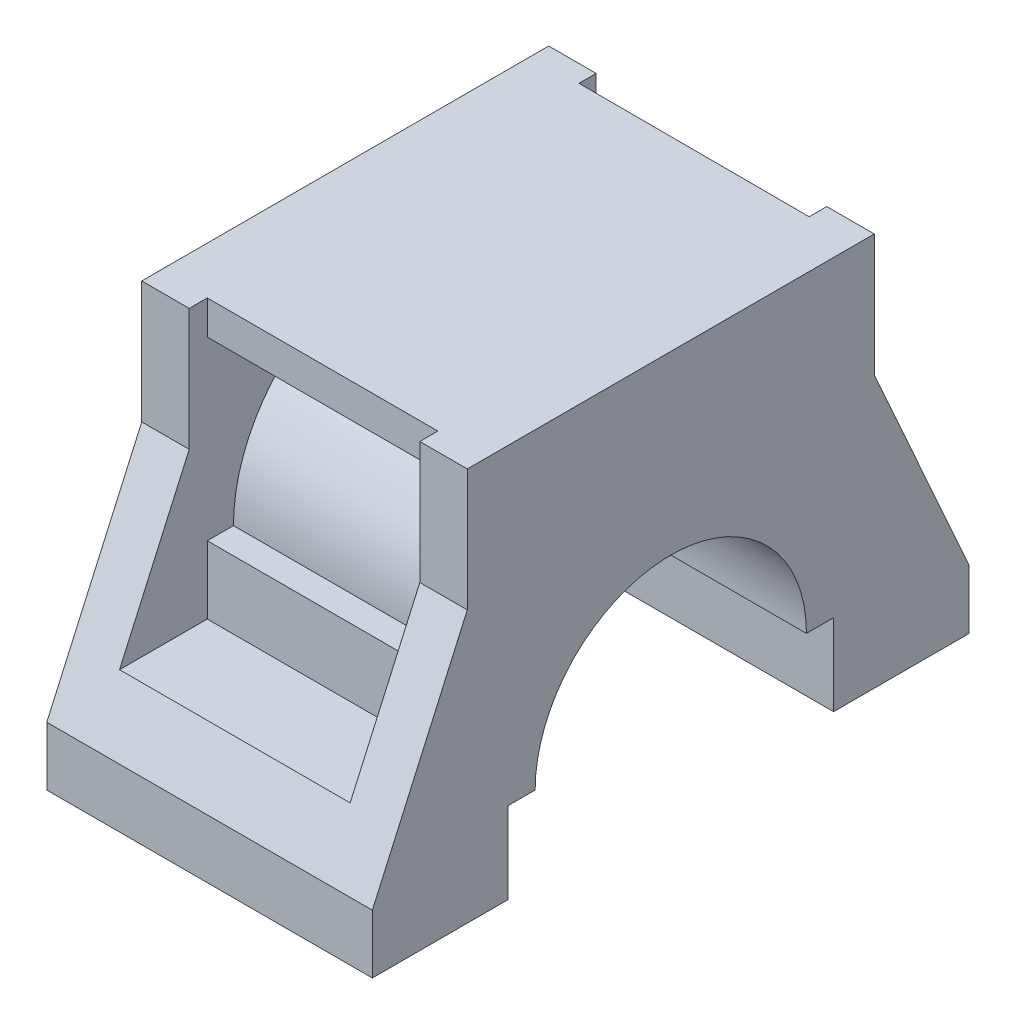
ISO-10303-21;
HEADER;
FILE_DESCRIPTION(('STEP AP214'),'2;1');
FILE_NAME('part.step','',(''),(''),'','','');
FILE_SCHEMA(('AUTOMOTIVE_DESIGN { 1 0 10303 214 1 1 1 1 }'));
ENDSEC;
DATA;
#1=APPLICATION_CONTEXT('core data for automotive mechanical design processes');
#2=APPLICATION_PROTOCOL_DEFINITION('international standard','automotive_design',2000,#1);
#3=PRODUCT_CONTEXT('',#1,'mechanical');
#4=PRODUCT('Part','Part','',(#3));
#5=PRODUCT_RELATED_PRODUCT_CATEGORY('part','',(#4));
#6=PRODUCT_DEFINITION_FORMATION('','',#4);
#7=PRODUCT_DEFINITION_CONTEXT('part definition',#1,'design');
#8=PRODUCT_DEFINITION('design','',#6,#7);
#9=PRODUCT_DEFINITION_SHAPE('','',#8);
#10=(LENGTH_UNIT() NAMED_UNIT(*) SI_UNIT(.MILLI.,.METRE.));
#11=(NAMED_UNIT(*) PLANE_ANGLE_UNIT() SI_UNIT($,.RADIAN.));
#12=(NAMED_UNIT(*) SI_UNIT($,.STERADIAN.) SOLID_ANGLE_UNIT());
#13=UNCERTAINTY_MEASURE_WITH_UNIT(LENGTH_MEASURE(1.E-05),#10,'distance_accuracy_value','');
#14=(GEOMETRIC_REPRESENTATION_CONTEXT(3) GLOBAL_UNCERTAINTY_ASSIGNED_CONTEXT((#13)) GLOBAL_UNIT_ASSIGNED_CONTEXT((#10,
#11,#12)) REPRESENTATION_CONTEXT('',''));
#15=CARTESIAN_POINT('',(0.,0.,0.));
#16=DIRECTION('',(0.,0.,1.));
#17=DIRECTION('',(1.,0.,0.));
#18=AXIS2_PLACEMENT_3D('',#15,#16,#17);
#19=CARTESIAN_POINT('',(-41.,0.,0.));
#20=DIRECTION('',(1.,0.,0.));
#21=DIRECTION('',(0.,0.,-1.));
#22=AXIS2_PLACEMENT_3D('',#19,#20,#21);
#23=PLANE('',#22);
#24=DIRECTION('',(0.,1.,0.));
#25=VECTOR('',#24,1.);
#26=CARTESIAN_POINT('',(-41.,53.,-48.7073269092221));
#27=LINE('',#26,#25);
#28=CARTESIAN_POINT('',(-41.,53.,-48.7073269092221));
#29=VERTEX_POINT('',#28);
#30=CARTESIAN_POINT('',(-41.,58.,-48.7073269092222));
#31=VERTEX_POINT('',#30);
#32=EDGE_CURVE('E57',#29,#31,#27,.T.);
#33=ORIENTED_EDGE('',*,*,#32,.F.);
#34=DIRECTION('',(0.,0.,1.));
#35=VECTOR('',#34,1.);
#36=CARTESIAN_POINT('',(-41.,53.,6.10030878605199));
#37=LINE('',#36,#35);
#38=CARTESIAN_POINT('',(-41.,53.,6.10030878605199));
#39=VERTEX_POINT('',#38);
#40=EDGE_CURVE('E52',#29,#39,#37,.T.);
#41=ORIENTED_EDGE('',*,*,#40,.T.);
#42=DIRECTION('',(0.,1.,0.));
#43=VECTOR('',#42,1.);
#44=CARTESIAN_POINT('',(-41.,53.,6.10030878605199));
#45=LINE('',#44,#43);
#46=CARTESIAN_POINT('',(-41.,58.,6.10030878605199));
#47=VERTEX_POINT('',#46);
#48=EDGE_CURVE('E268',#39,#47,#45,.T.);
#49=ORIENTED_EDGE('',*,*,#48,.T.);
#50=DIRECTION('',(0.,0.,1.));
#51=VECTOR('',#50,1.);
#52=CARTESIAN_POINT('',(-41.,58.,1.03810320160909));
#53=LINE('',#52,#51);
#54=CARTESIAN_POINT('',(-41.,58.,8.76398802670966));
#55=VERTEX_POINT('',#54);
#56=EDGE_CURVE('E361',#47,#55,#53,.T.);
#57=ORIENTED_EDGE('',*,*,#56,.T.);
#58=DIRECTION('',(0.,-1.,0.));
#59=VECTOR('',#58,1.);
#60=CARTESIAN_POINT('',(-41.,58.,8.76398802670966));
#61=LINE('',#60,#59);
#62=CARTESIAN_POINT('',(-41.,40.,8.76398802670966));
#63=VERTEX_POINT('',#62);
#64=EDGE_CURVE('E352',#55,#63,#61,.T.);
#65=ORIENTED_EDGE('',*,*,#64,.T.);
#66=DIRECTION('',(0.,-0.913045383372762,0.407857975160086));
#67=VECTOR('',#66,1.);
#68=CARTESIAN_POINT('',(-41.,40.,8.76398802670966));
#69=LINE('',#68,#67);
#70=CARTESIAN_POINT('',(-41.,17.,19.0381032016091));
#71=VERTEX_POINT('',#70);
#72=EDGE_CURVE('E354',#63,#71,#69,.T.);
#73=ORIENTED_EDGE('',*,*,#72,.T.);
#74=DIRECTION('',(0.,0.,-1.));
#75=VECTOR('',#74,1.);
#76=CARTESIAN_POINT('',(-41.,17.,19.0381032016091));
#77=LINE('',#76,#75);
#78=CARTESIAN_POINT('',(-41.,17.,6.10030878605199));
#79=VERTEX_POINT('',#78);
#80=EDGE_CURVE('E358',#71,#79,#77,.T.);
#81=ORIENTED_EDGE('',*,*,#80,.T.);
#82=DIRECTION('',(0.,-1.,0.));
#83=VECTOR('',#82,1.);
#84=CARTESIAN_POINT('',(-41.,27.,6.10030878605199));
#85=LINE('',#84,#83);
#86=CARTESIAN_POINT('',(-41.,27.,6.10030878605199));
#87=VERTEX_POINT('',#86);
#88=EDGE_CURVE('E348',#87,#79,#85,.T.);
#89=ORIENTED_EDGE('',*,*,#88,.F.);
#90=DIRECTION('',(0.,0.,1.));
#91=VECTOR('',#90,1.);
#92=CARTESIAN_POINT('',(-41.,27.,6.10030878605199));
#93=LINE('',#92,#91);
#94=CARTESIAN_POINT('',(-41.,27.,2.24605546048965));
#95=VERTEX_POINT('',#94);
#96=EDGE_CURVE('E336',#95,#87,#93,.T.);
#97=ORIENTED_EDGE('',*,*,#96,.F.);
#98=CARTESIAN_POINT('',(-41.,27.,-21.7539445395103));
#99=DIRECTION('',(1.,0.,0.));
#100=DIRECTION('',(0.,0.,1.));
#101=AXIS2_PLACEMENT_3D('',#98,#99,#100);
#102=CIRCLE('',#101,24.);
#103=CARTESIAN_POINT('',(-41.,36.9865070630861,-43.5775481988268));
#104=VERTEX_POINT('',#103);
#105=EDGE_CURVE('E305',#104,#95,#102,.T.);
#106=ORIENTED_EDGE('',*,*,#105,.F.);
#107=DIRECTION('',(0.,-1.,0.));
#108=VECTOR('',#107,1.);
#109=CARTESIAN_POINT('',(-41.,37.,-43.5775481988268));
#110=LINE('',#109,#108);
#111=CARTESIAN_POINT('',(-41.,37.,-43.5775481988268));
#112=VERTEX_POINT('',#111);
#113=EDGE_CURVE('E302',#112,#104,#110,.T.);
#114=ORIENTED_EDGE('',*,*,#113,.F.);
#115=DIRECTION('',(0.,0.,1.));
#116=VECTOR('',#115,1.);
#117=CARTESIAN_POINT('',(-41.,37.,-48.6375481988268));
#118=LINE('',#117,#116);
#119=CARTESIAN_POINT('',(-41.,37.,-48.6375481988268));
#120=VERTEX_POINT('',#119);
#121=EDGE_CURVE('E279',#120,#112,#118,.T.);
#122=ORIENTED_EDGE('',*,*,#121,.F.);
#123=DIRECTION('',(0.,-1.,0.));
#124=VECTOR('',#123,1.);
#125=CARTESIAN_POINT('',(-41.,37.,-48.6375481988268));
#126=LINE('',#125,#124);
#127=CARTESIAN_POINT('',(-41.,27.,-48.6375481988268));
#128=VERTEX_POINT('',#127);
#129=EDGE_CURVE('E292',#120,#128,#126,.T.);
#130=ORIENTED_EDGE('',*,*,#129,.T.);
#131=DIRECTION('',(0.,0.,1.));
#132=VECTOR('',#131,1.);
#133=CARTESIAN_POINT('',(-41.,27.,-65.2360119732903));
#134=LINE('',#133,#132);
#135=CARTESIAN_POINT('',(-41.,27.,-57.0431205504074));
#136=VERTEX_POINT('',#135);
#137=EDGE_CURVE('E319',#136,#128,#134,.T.);
#138=ORIENTED_EDGE('',*,*,#137,.F.);
#139=DIRECTION('',(0.,0.913045383372762,0.407857975160086));
#140=VECTOR('',#139,1.);
#141=CARTESIAN_POINT('',(-41.,40.,-51.2360119732903));
#142=LINE('',#141,#140);
#143=CARTESIAN_POINT('',(-41.,40.,-51.2360119732903));
#144=VERTEX_POINT('',#143);
#145=EDGE_CURVE('E328',#136,#144,#142,.T.);
#146=ORIENTED_EDGE('',*,*,#145,.T.);
#147=DIRECTION('',(0.,1.,0.));
#148=VECTOR('',#147,1.);
#149=CARTESIAN_POINT('',(-41.,58.,-51.2360119732903));
#150=LINE('',#149,#148);
#151=CARTESIAN_POINT('',(-41.,58.,-51.2360119732903));
#152=VERTEX_POINT('',#151);
#153=EDGE_CURVE('E330',#144,#152,#150,.T.);
#154=ORIENTED_EDGE('',*,*,#153,.T.);
#155=EDGE_CURVE('E362',#152,#31,#53,.T.);
#156=ORIENTED_EDGE('',*,*,#155,.T.);
#157=EDGE_LOOP('',(#33,#41,#49,#57,#65,#73,#81,#89,#97,#106,#114,#122,#130,#138,#146,#154,#156));
#158=FACE_BOUND('',#157,.T.);
#159=ADVANCED_FACE('F37',(#158),#23,.T.);
#160=CARTESIAN_POINT('',(-7.,0.,0.));
#161=DIRECTION('',(1.,0.,0.));
#162=DIRECTION('',(0.,0.,-1.));
#163=AXIS2_PLACEMENT_3D('',#160,#161,#162);
#164=PLANE('',#163);
#165=DIRECTION('',(0.,0.,-1.));
#166=VECTOR('',#165,1.);
#167=CARTESIAN_POINT('',(-7.,53.,-48.6375481988268));
#168=LINE('',#167,#166);
#169=CARTESIAN_POINT('',(-7.,53.,6.10030878605199));
#170=VERTEX_POINT('',#169);
#171=CARTESIAN_POINT('',(-7.,53.,-48.6375481988268));
#172=VERTEX_POINT('',#171);
#173=EDGE_CURVE('E252',#170,#172,#168,.T.);
#174=ORIENTED_EDGE('',*,*,#173,.T.);
#175=DIRECTION('',(0.,1.,0.));
#176=VECTOR('',#175,1.);
#177=CARTESIAN_POINT('',(-7.,53.,-48.6375481988268));
#178=LINE('',#177,#176);
#179=CARTESIAN_POINT('',(-7.,58.,-48.6375481988268));
#180=VERTEX_POINT('',#179);
#181=EDGE_CURVE('E273',#172,#180,#178,.T.);
#182=ORIENTED_EDGE('',*,*,#181,.T.);
#183=DIRECTION('',(0.,0.,1.));
#184=VECTOR('',#183,1.);
#185=CARTESIAN_POINT('',(-7.,58.,1.03810320160909));
#186=LINE('',#185,#184);
#187=CARTESIAN_POINT('',(-7.,58.,-51.2360119732903));
#188=VERTEX_POINT('',#187);
#189=EDGE_CURVE('E355',#188,#180,#186,.T.);
#190=ORIENTED_EDGE('',*,*,#189,.F.);
#191=DIRECTION('',(0.,-1.,0.));
#192=VECTOR('',#191,1.);
#193=CARTESIAN_POINT('',(-7.,58.,-51.2360119732903));
#194=LINE('',#193,#192);
#195=CARTESIAN_POINT('',(-7.,40.,-51.2360119732903));
#196=VERTEX_POINT('',#195);
#197=EDGE_CURVE('E326',#188,#196,#194,.T.);
#198=ORIENTED_EDGE('',*,*,#197,.T.);
#199=DIRECTION('',(0.,-0.913045383372762,-0.407857975160086));
#200=VECTOR('',#199,1.);
#201=CARTESIAN_POINT('',(-7.,40.,-51.2360119732903));
#202=LINE('',#201,#200);
#203=CARTESIAN_POINT('',(-7.,27.,-57.0431205504074));
#204=VERTEX_POINT('',#203);
#205=EDGE_CURVE('E322',#196,#204,#202,.T.);
#206=ORIENTED_EDGE('',*,*,#205,.T.);
#207=DIRECTION('',(0.,0.,1.));
#208=VECTOR('',#207,1.);
#209=CARTESIAN_POINT('',(-7.,27.,-65.2360119732903));
#210=LINE('',#209,#208);
#211=CARTESIAN_POINT('',(-7.,27.,-48.6375481988268));
#212=VERTEX_POINT('',#211);
#213=EDGE_CURVE('E318',#204,#212,#210,.T.);
#214=ORIENTED_EDGE('',*,*,#213,.T.);
#215=DIRECTION('',(0.,-1.,0.));
#216=VECTOR('',#215,1.);
#217=CARTESIAN_POINT('',(-7.,37.,-48.6375481988268));
#218=LINE('',#217,#216);
#219=CARTESIAN_POINT('',(-7.,37.,-48.6375481988268));
#220=VERTEX_POINT('',#219);
#221=EDGE_CURVE('E296',#220,#212,#218,.T.);
#222=ORIENTED_EDGE('',*,*,#221,.F.);
#223=DIRECTION('',(0.,0.,-1.));
#224=VECTOR('',#223,1.);
#225=CARTESIAN_POINT('',(-7.,37.,-43.5775481988268));
#226=LINE('',#225,#224);
#227=CARTESIAN_POINT('',(-7.,37.,-43.5775481988268));
#228=VERTEX_POINT('',#227);
#229=EDGE_CURVE('E286',#228,#220,#226,.T.);
#230=ORIENTED_EDGE('',*,*,#229,.F.);
#231=DIRECTION('',(0.,-1.,0.));
#232=VECTOR('',#231,1.);
#233=CARTESIAN_POINT('',(-7.,37.,-43.5775481988268));
#234=LINE('',#233,#232);
#235=CARTESIAN_POINT('',(-7.,36.9865070630861,-43.5775481988268));
#236=VERTEX_POINT('',#235);
#237=EDGE_CURVE('E299',#228,#236,#234,.T.);
#238=ORIENTED_EDGE('',*,*,#237,.T.);
#239=CARTESIAN_POINT('',(-7.,27.,-21.7539445395103));
#240=DIRECTION('',(1.,0.,0.));
#241=DIRECTION('',(0.,0.,1.));
#242=AXIS2_PLACEMENT_3D('',#239,#240,#241);
#243=CIRCLE('',#242,24.);
#244=CARTESIAN_POINT('',(-7.,27.,2.24605546048965));
#245=VERTEX_POINT('',#244);
#246=EDGE_CURVE('E306',#236,#245,#243,.T.);
#247=ORIENTED_EDGE('',*,*,#246,.T.);
#248=DIRECTION('',(0.,0.,-1.));
#249=VECTOR('',#248,1.);
#250=CARTESIAN_POINT('',(-7.,27.,1.03810320160909));
#251=LINE('',#250,#249);
#252=CARTESIAN_POINT('',(-7.,27.,6.10030878605199));
#253=VERTEX_POINT('',#252);
#254=EDGE_CURVE('E341',#253,#245,#251,.T.);
#255=ORIENTED_EDGE('',*,*,#254,.F.);
#256=DIRECTION('',(0.,-1.,0.));
#257=VECTOR('',#256,1.);
#258=CARTESIAN_POINT('',(-7.,27.,6.10030878605199));
#259=LINE('',#258,#257);
#260=CARTESIAN_POINT('',(-7.,17.,6.10030878605199));
#261=VERTEX_POINT('',#260);
#262=EDGE_CURVE('E344',#253,#261,#259,.T.);
#263=ORIENTED_EDGE('',*,*,#262,.T.);
#264=DIRECTION('',(0.,0.,-1.));
#265=VECTOR('',#264,1.);
#266=CARTESIAN_POINT('',(-7.,17.,19.0381032016091));
#267=LINE('',#266,#265);
#268=CARTESIAN_POINT('',(-7.,17.,19.0381032016091));
#269=VERTEX_POINT('',#268);
#270=EDGE_CURVE('E370',#269,#261,#267,.T.);
#271=ORIENTED_EDGE('',*,*,#270,.F.);
#272=DIRECTION('',(0.,-0.913045383372762,0.407857975160086));
#273=VECTOR('',#272,1.);
#274=CARTESIAN_POINT('',(-7.,40.,8.76398802670966));
#275=LINE('',#274,#273);
#276=CARTESIAN_POINT('',(-7.,40.,8.76398802670966));
#277=VERTEX_POINT('',#276);
#278=EDGE_CURVE('E367',#277,#269,#275,.T.);
#279=ORIENTED_EDGE('',*,*,#278,.F.);
#280=DIRECTION('',(0.,-1.,0.));
#281=VECTOR('',#280,1.);
#282=CARTESIAN_POINT('',(-7.,58.,8.76398802670966));
#283=LINE('',#282,#281);
#284=CARTESIAN_POINT('',(-7.,58.,8.76398802670966));
#285=VERTEX_POINT('',#284);
#286=EDGE_CURVE('E351',#285,#277,#283,.T.);
#287=ORIENTED_EDGE('',*,*,#286,.F.);
#288=CARTESIAN_POINT('',(-7.,58.,6.10030878605199));
#289=VERTEX_POINT('',#288);
#290=EDGE_CURVE('E272',#289,#285,#186,.T.);
#291=ORIENTED_EDGE('',*,*,#290,.F.);
#292=DIRECTION('',(0.,1.,0.));
#293=VECTOR('',#292,1.);
#294=CARTESIAN_POINT('',(-7.,53.,6.10030878605199));
#295=LINE('',#294,#293);
#296=EDGE_CURVE('E266',#170,#289,#295,.T.);
#297=ORIENTED_EDGE('',*,*,#296,.F.);
#298=EDGE_LOOP('',(#174,#182,#190,#198,#206,#214,#222,#230,#238,#247,#255,#263,#271,#279,#287,
#291,#297));
#299=FACE_BOUND('',#298,.T.);
#300=ADVANCED_FACE('F270',(#299),#164,.F.);
#301=CARTESIAN_POINT('',(-7.,27.,-65.2360119732903));
#302=DIRECTION('',(0.,-1.,0.));
#303=DIRECTION('',(0.,0.,-1.));
#304=AXIS2_PLACEMENT_3D('',#301,#302,#303);
#305=PLANE('',#304);
#306=DIRECTION('',(-1.,0.,0.));
#307=VECTOR('',#306,1.);
#308=CARTESIAN_POINT('',(-7.,27.,-48.6375481988268));
#309=LINE('',#308,#307);
#310=EDGE_CURVE('E283',#212,#128,#309,.T.);
#311=ORIENTED_EDGE('',*,*,#310,.F.);
#312=ORIENTED_EDGE('',*,*,#213,.F.);
#313=DIRECTION('',(-1.,0.,0.));
#314=VECTOR('',#313,1.);
#315=CARTESIAN_POINT('',(-48.,27.,-57.0431205504074));
#316=LINE('',#315,#314);
#317=EDGE_CURVE('E333',#204,#136,#316,.T.);
#318=ORIENTED_EDGE('',*,*,#317,.T.);
#319=ORIENTED_EDGE('',*,*,#137,.T.);
#320=EDGE_LOOP('',(#311,#312,#318,#319));
#321=FACE_BOUND('',#320,.T.);
#322=ADVANCED_FACE('F532',(#321),#305,.F.);
#323=CARTESIAN_POINT('',(-7.,27.,-21.7539445395103));
#324=DIRECTION('',(-1.,0.,0.));
#325=DIRECTION('',(0.,0.,1.));
#326=AXIS2_PLACEMENT_3D('',#323,#324,#325);
#327=CYLINDRICAL_SURFACE('',#326,24.);
#328=DIRECTION('',(-1.,0.,0.));
#329=VECTOR('',#328,1.);
#330=CARTESIAN_POINT('',(-7.,36.9865070630861,-43.5775481988268));
#331=LINE('',#330,#329);
#332=EDGE_CURVE('E11',#104,#236,#331,.F.);
#333=ORIENTED_EDGE('',*,*,#332,.F.);
#334=ORIENTED_EDGE('',*,*,#105,.T.);
#335=DIRECTION('',(-1.,0.,0.));
#336=VECTOR('',#335,1.);
#337=CARTESIAN_POINT('',(-7.,27.,2.24605546048965));
#338=LINE('',#337,#336);
#339=EDGE_CURVE('E312',#245,#95,#338,.T.);
#340=ORIENTED_EDGE('',*,*,#339,.F.);
#341=ORIENTED_EDGE('',*,*,#246,.F.);
#342=EDGE_LOOP('',(#333,#334,#340,#341));
#343=FACE_BOUND('',#342,.T.);
#344=ADVANCED_FACE('F675',(#343),#327,.T.);
#345=CARTESIAN_POINT('',(0.,27.,0.));
#346=DIRECTION('',(0.,-1.,0.));
#347=DIRECTION('',(0.,0.,-1.));
#348=AXIS2_PLACEMENT_3D('',#345,#346,#347);
#349=PLANE('',#348);
#350=ORIENTED_EDGE('',*,*,#339,.T.);
#351=ORIENTED_EDGE('',*,*,#96,.T.);
#352=DIRECTION('',(1.,0.,0.));
#353=VECTOR('',#352,1.);
#354=CARTESIAN_POINT('',(-7.,27.,6.10030878605199));
#355=LINE('',#354,#353);
#356=EDGE_CURVE('E338',#87,#253,#355,.T.);
#357=ORIENTED_EDGE('',*,*,#356,.T.);
#358=ORIENTED_EDGE('',*,*,#254,.T.);
#359=EDGE_LOOP('',(#350,#351,#357,#358));
#360=FACE_BOUND('',#359,.T.);
#361=ADVANCED_FACE('F674',(#360),#349,.F.);
#362=CARTESIAN_POINT('',(-48.,58.,-51.2360119732903));
#363=DIRECTION('',(0.,0.,-1.));
#364=DIRECTION('',(-1.,0.,0.));
#365=AXIS2_PLACEMENT_3D('',#362,#363,#364);
#366=PLANE('',#365);
#367=ORIENTED_EDGE('',*,*,#153,.F.);
#368=DIRECTION('',(1.,0.,0.));
#369=VECTOR('',#368,1.);
#370=CARTESIAN_POINT('',(-48.,40.,-51.2360119732903));
#371=LINE('',#370,#369);
#372=CARTESIAN_POINT('',(-48.,40.,-51.2360119732903));
#373=VERTEX_POINT('',#372);
#374=EDGE_CURVE('E478',#373,#144,#371,.T.);
#375=ORIENTED_EDGE('',*,*,#374,.F.);
#376=DIRECTION('',(0.,1.,0.));
#377=VECTOR('',#376,1.);
#378=CARTESIAN_POINT('',(-48.,58.,-51.2360119732903));
#379=LINE('',#378,#377);
#380=CARTESIAN_POINT('',(-48.,58.,-51.2360119732903));
#381=VERTEX_POINT('',#380);
#382=EDGE_CURVE('E405',#373,#381,#379,.T.);
#383=ORIENTED_EDGE('',*,*,#382,.T.);
#384=DIRECTION('',(1.,0.,0.));
#385=VECTOR('',#384,1.);
#386=CARTESIAN_POINT('',(-48.,58.,-51.2360119732903));
#387=LINE('',#386,#385);
#388=EDGE_CURVE('E474',#381,#152,#387,.T.);
#389=ORIENTED_EDGE('',*,*,#388,.T.);
#390=EDGE_LOOP('',(#367,#375,#383,#389));
#391=FACE_BOUND('',#390,.T.);
#392=ADVANCED_FACE('F541',(#391),#366,.T.);
#393=CARTESIAN_POINT('',(-41.,17.,19.0381032016091));
#394=DIRECTION('',(0.,-1.,0.));
#395=DIRECTION('',(0.,0.,-1.));
#396=AXIS2_PLACEMENT_3D('',#393,#394,#395);
#397=PLANE('',#396);
#398=DIRECTION('',(1.,0.,0.));
#399=VECTOR('',#398,1.);
#400=CARTESIAN_POINT('',(-7.,17.,6.10030878605199));
#401=LINE('',#400,#399);
#402=EDGE_CURVE('E335',#79,#261,#401,.T.);
#403=ORIENTED_EDGE('',*,*,#402,.F.);
#404=ORIENTED_EDGE('',*,*,#80,.F.);
#405=DIRECTION('',(1.,0.,0.));
#406=VECTOR('',#405,1.);
#407=CARTESIAN_POINT('',(-41.,17.,19.0381032016091));
#408=LINE('',#407,#406);
#409=EDGE_CURVE('E364',#71,#269,#408,.T.);
#410=ORIENTED_EDGE('',*,*,#409,.T.);
#411=ORIENTED_EDGE('',*,*,#270,.T.);
#412=EDGE_LOOP('',(#403,#404,#410,#411));
#413=FACE_BOUND('',#412,.T.);
#414=ADVANCED_FACE('F537',(#413),#397,.F.);
#415=CARTESIAN_POINT('',(-48.,8.65910158505191,22.7639880267097));
#416=DIRECTION('',(0.,0.407857975160086,0.913045383372762));
#417=DIRECTION('',(0.,-0.913045383372763,0.407857975160086));
#418=AXIS2_PLACEMENT_3D('',#415,#416,#417);
#419=PLANE('',#418);
#420=ORIENTED_EDGE('',*,*,#409,.F.);
#421=ORIENTED_EDGE('',*,*,#72,.F.);
#422=DIRECTION('',(1.,0.,0.));
#423=VECTOR('',#422,1.);
#424=CARTESIAN_POINT('',(-48.,40.,8.76398802670966));
#425=LINE('',#424,#423);
#426=CARTESIAN_POINT('',(-48.,40.,8.76398802670966));
#427=VERTEX_POINT('',#426);
#428=EDGE_CURVE('E466',#427,#63,#425,.T.);
#429=ORIENTED_EDGE('',*,*,#428,.F.);
#430=DIRECTION('',(0.,-0.913045383372763,0.407857975160086));
#431=VECTOR('',#430,1.);
#432=CARTESIAN_POINT('',(-48.,8.65910158505191,22.7639880267097));
#433=LINE('',#432,#431);
#434=CARTESIAN_POINT('',(-48.,8.65910158505191,22.7639880267097));
#435=VERTEX_POINT('',#434);
#436=EDGE_CURVE('E414',#427,#435,#433,.T.);
#437=ORIENTED_EDGE('',*,*,#436,.T.);
#438=DIRECTION('',(1.,0.,0.));
#439=VECTOR('',#438,1.);
#440=CARTESIAN_POINT('',(-48.,8.65910158505191,22.7639880267097));
#441=LINE('',#440,#439);
#442=CARTESIAN_POINT('',(0.,8.65910158505191,22.7639880267097));
#443=VERTEX_POINT('',#442);
#444=EDGE_CURVE('E464',#435,#443,#441,.T.);
#445=ORIENTED_EDGE('',*,*,#444,.T.);
#446=DIRECTION('',(0.,-0.913045383372763,0.407857975160086));
#447=VECTOR('',#446,1.);
#448=CARTESIAN_POINT('',(0.,8.65910158505191,22.7639880267097));
#449=LINE('',#448,#447);
#450=CARTESIAN_POINT('',(0.,40.,8.76398802670966));
#451=VERTEX_POINT('',#450);
#452=EDGE_CURVE('E456',#451,#443,#449,.T.);
#453=ORIENTED_EDGE('',*,*,#452,.F.);
#454=EDGE_CURVE('E469',#277,#451,#425,.T.);
#455=ORIENTED_EDGE('',*,*,#454,.F.);
#456=ORIENTED_EDGE('',*,*,#278,.T.);
#457=EDGE_LOOP('',(#420,#421,#429,#437,#445,#453,#455,#456));
#458=FACE_BOUND('',#457,.T.);
#459=ADVANCED_FACE('F540',(#458),#419,.T.);
#460=CARTESIAN_POINT('',(-48.,40.,8.76398802670966));
#461=DIRECTION('',(0.,0.,1.));
#462=DIRECTION('',(0.,-1.,0.));
#463=AXIS2_PLACEMENT_3D('',#460,#461,#462);
#464=PLANE('',#463);
#465=ORIENTED_EDGE('',*,*,#428,.T.);
#466=ORIENTED_EDGE('',*,*,#64,.F.);
#467=DIRECTION('',(1.,0.,0.));
#468=VECTOR('',#467,1.);
#469=CARTESIAN_POINT('',(-48.,58.,8.76398802670966));
#470=LINE('',#469,#468);
#471=CARTESIAN_POINT('',(-48.,58.,8.76398802670966));
#472=VERTEX_POINT('',#471);
#473=EDGE_CURVE('E470',#472,#55,#470,.T.);
#474=ORIENTED_EDGE('',*,*,#473,.F.);
#475=DIRECTION('',(0.,-1.,0.));
#476=VECTOR('',#475,1.);
#477=CARTESIAN_POINT('',(-48.,40.,8.76398802670966));
#478=LINE('',#477,#476);
#479=EDGE_CURVE('E411',#472,#427,#478,.T.);
#480=ORIENTED_EDGE('',*,*,#479,.T.);
#481=EDGE_LOOP('',(#465,#466,#474,#480));
#482=FACE_BOUND('',#481,.T.);
#483=ADVANCED_FACE('F559',(#482),#464,.T.);
#484=CARTESIAN_POINT('',(-48.,58.,8.76398802670966));
#485=DIRECTION('',(0.,1.,0.));
#486=DIRECTION('',(0.,0.,1.));
#487=AXIS2_PLACEMENT_3D('',#484,#485,#486);
#488=PLANE('',#487);
#489=CARTESIAN_POINT('',(0.,58.,-51.2360119732903));
#490=VERTEX_POINT('',#489);
#491=EDGE_CURVE('E477',#188,#490,#387,.T.);
#492=ORIENTED_EDGE('',*,*,#491,.F.);
#493=ORIENTED_EDGE('',*,*,#189,.T.);
#494=DIRECTION('',(-0.999997894008199,0.,-0.00205231068946781));
#495=VECTOR('',#494,1.);
#496=CARTESIAN_POINT('',(-41.,58.,-48.7073269092221));
#497=LINE('',#496,#495);
#498=EDGE_CURVE('E652',#180,#31,#497,.T.);
#499=ORIENTED_EDGE('',*,*,#498,.T.);
#500=ORIENTED_EDGE('',*,*,#155,.F.);
#501=ORIENTED_EDGE('',*,*,#388,.F.);
#502=DIRECTION('',(0.,0.,1.));
#503=VECTOR('',#502,1.);
#504=CARTESIAN_POINT('',(-48.,58.,8.76398802670966));
#505=LINE('',#504,#503);
#506=EDGE_CURVE('E408',#381,#472,#505,.T.);
#507=ORIENTED_EDGE('',*,*,#506,.T.);
#508=ORIENTED_EDGE('',*,*,#473,.T.);
#509=ORIENTED_EDGE('',*,*,#56,.F.);
#510=DIRECTION('',(1.,0.,0.));
#511=VECTOR('',#510,1.);
#512=CARTESIAN_POINT('',(-7.,58.,6.10030878605199));
#513=LINE('',#512,#511);
#514=EDGE_CURVE('E651',#47,#289,#513,.T.);
#515=ORIENTED_EDGE('',*,*,#514,.T.);
#516=ORIENTED_EDGE('',*,*,#290,.T.);
#517=CARTESIAN_POINT('',(0.,58.,8.76398802670966));
#518=VERTEX_POINT('',#517);
#519=EDGE_CURVE('E473',#285,#518,#470,.T.);
#520=ORIENTED_EDGE('',*,*,#519,.T.);
#521=DIRECTION('',(0.,0.,1.));
#522=VECTOR('',#521,1.);
#523=CARTESIAN_POINT('',(0.,58.,8.76398802670966));
#524=LINE('',#523,#522);
#525=EDGE_CURVE('E450',#490,#518,#524,.T.);
#526=ORIENTED_EDGE('',*,*,#525,.F.);
#527=EDGE_LOOP('',(#492,#493,#499,#500,#501,#507,#508,#509,#515,#516,#520,#526));
#528=FACE_BOUND('',#527,.T.);
#529=ADVANCED_FACE('F565',(#528),#488,.T.);
#530=CARTESIAN_POINT('',(-48.,0.,22.7639880267097));
#531=DIRECTION('',(0.,-1.,0.));
#532=DIRECTION('',(0.,0.,-1.));
#533=AXIS2_PLACEMENT_3D('',#530,#531,#532);
#534=PLANE('',#533);
#535=DIRECTION('',(0.,0.,-1.));
#536=VECTOR('',#535,1.);
#537=CARTESIAN_POINT('',(0.,0.,22.7639880267097));
#538=LINE('',#537,#536);
#539=CARTESIAN_POINT('',(0.,0.,22.7639880267097));
#540=VERTEX_POINT('',#539);
#541=CARTESIAN_POINT('',(0.,0.,2.76398802670966));
#542=VERTEX_POINT('',#541);
#543=EDGE_CURVE('E376',#540,#542,#538,.T.);
#544=ORIENTED_EDGE('',*,*,#543,.F.);
#545=DIRECTION('',(1.,0.,0.));
#546=VECTOR('',#545,1.);
#547=CARTESIAN_POINT('',(-48.,0.,22.7639880267097));
#548=LINE('',#547,#546);
#549=CARTESIAN_POINT('',(-48.,0.,22.7639880267097));
#550=VERTEX_POINT('',#549);
#551=EDGE_CURVE('E461',#550,#540,#548,.T.);
#552=ORIENTED_EDGE('',*,*,#551,.F.);
#553=DIRECTION('',(0.,0.,-1.));
#554=VECTOR('',#553,1.);
#555=CARTESIAN_POINT('',(-48.,0.,22.7639880267097));
#556=LINE('',#555,#554);
#557=CARTESIAN_POINT('',(-48.,0.,2.76398802670966));
#558=VERTEX_POINT('',#557);
#559=EDGE_CURVE('E377',#550,#558,#556,.T.);
#560=ORIENTED_EDGE('',*,*,#559,.T.);
#561=DIRECTION('',(1.,0.,0.));
#562=VECTOR('',#561,1.);
#563=CARTESIAN_POINT('',(-48.,0.,2.76398802670966));
#564=LINE('',#563,#562);
#565=EDGE_CURVE('E420',#558,#542,#564,.T.);
#566=ORIENTED_EDGE('',*,*,#565,.T.);
#567=EDGE_LOOP('',(#544,#552,#560,#566));
#568=FACE_BOUND('',#567,.T.);
#569=ADVANCED_FACE('F39',(#568),#534,.T.);
#570=CARTESIAN_POINT('',(-48.,0.,22.7639880267097));
#571=DIRECTION('',(0.,0.,1.));
#572=DIRECTION('',(1.,0.,0.));
#573=AXIS2_PLACEMENT_3D('',#570,#571,#572);
#574=PLANE('',#573);
#575=DIRECTION('',(0.,-1.,0.));
#576=VECTOR('',#575,1.);
#577=CARTESIAN_POINT('',(0.,0.,22.7639880267097));
#578=LINE('',#577,#576);
#579=EDGE_CURVE('E381',#443,#540,#578,.T.);
#580=ORIENTED_EDGE('',*,*,#579,.F.);
#581=ORIENTED_EDGE('',*,*,#444,.F.);
#582=DIRECTION('',(0.,-1.,0.));
#583=VECTOR('',#582,1.);
#584=CARTESIAN_POINT('',(-48.,0.,22.7639880267097));
#585=LINE('',#584,#583);
#586=EDGE_CURVE('E417',#435,#550,#585,.T.);
#587=ORIENTED_EDGE('',*,*,#586,.T.);
#588=ORIENTED_EDGE('',*,*,#551,.T.);
#589=EDGE_LOOP('',(#580,#581,#587,#588));
#590=FACE_BOUND('',#589,.T.);
#591=ADVANCED_FACE('F552',(#590),#574,.T.);
#592=ORIENTED_EDGE('',*,*,#286,.T.);
#593=ORIENTED_EDGE('',*,*,#454,.T.);
#594=DIRECTION('',(0.,-1.,0.));
#595=VECTOR('',#594,1.);
#596=CARTESIAN_POINT('',(0.,40.,8.76398802670966));
#597=LINE('',#596,#595);
#598=EDGE_CURVE('E453',#518,#451,#597,.T.);
#599=ORIENTED_EDGE('',*,*,#598,.F.);
#600=ORIENTED_EDGE('',*,*,#519,.F.);
#601=EDGE_LOOP('',(#592,#593,#599,#600));
#602=FACE_BOUND('',#601,.T.);
#603=ADVANCED_FACE('F555',(#602),#464,.T.);
#604=ORIENTED_EDGE('',*,*,#197,.F.);
#605=ORIENTED_EDGE('',*,*,#491,.T.);
#606=DIRECTION('',(0.,1.,0.));
#607=VECTOR('',#606,1.);
#608=CARTESIAN_POINT('',(0.,58.,-51.2360119732903));
#609=LINE('',#608,#607);
#610=CARTESIAN_POINT('',(0.,40.,-51.2360119732903));
#611=VERTEX_POINT('',#610);
#612=EDGE_CURVE('E447',#611,#490,#609,.T.);
#613=ORIENTED_EDGE('',*,*,#612,.F.);
#614=EDGE_CURVE('E481',#196,#611,#371,.T.);
#615=ORIENTED_EDGE('',*,*,#614,.F.);
#616=EDGE_LOOP('',(#604,#605,#613,#615));
#617=FACE_BOUND('',#616,.T.);
#618=ADVANCED_FACE('F563',(#617),#366,.T.);
#619=CARTESIAN_POINT('',(-48.,40.,-51.2360119732903));
#620=DIRECTION('',(0.,0.407857975160086,-0.913045383372762));
#621=DIRECTION('',(0.,0.913045383372762,0.407857975160086));
#622=AXIS2_PLACEMENT_3D('',#619,#620,#621);
#623=PLANE('',#622);
#624=ORIENTED_EDGE('',*,*,#145,.F.);
#625=ORIENTED_EDGE('',*,*,#317,.F.);
#626=ORIENTED_EDGE('',*,*,#205,.F.);
#627=ORIENTED_EDGE('',*,*,#614,.T.);
#628=DIRECTION('',(0.,0.913045383372762,0.407857975160086));
#629=VECTOR('',#628,1.);
#630=CARTESIAN_POINT('',(0.,40.,-51.2360119732903));
#631=LINE('',#630,#629);
#632=CARTESIAN_POINT('',(0.,8.65910158505191,-65.2360119732903));
#633=VERTEX_POINT('',#632);
#634=EDGE_CURVE('E444',#633,#611,#631,.T.);
#635=ORIENTED_EDGE('',*,*,#634,.F.);
#636=DIRECTION('',(1.,0.,0.));
#637=VECTOR('',#636,1.);
#638=CARTESIAN_POINT('',(-48.,8.65910158505191,-65.2360119732903));
#639=LINE('',#638,#637);
#640=CARTESIAN_POINT('',(-48.,8.65910158505191,-65.2360119732903));
#641=VERTEX_POINT('',#640);
#642=EDGE_CURVE('E482',#641,#633,#639,.T.);
#643=ORIENTED_EDGE('',*,*,#642,.F.);
#644=DIRECTION('',(0.,0.913045383372762,0.407857975160086));
#645=VECTOR('',#644,1.);
#646=CARTESIAN_POINT('',(-48.,40.,-51.2360119732903));
#647=LINE('',#646,#645);
#648=EDGE_CURVE('E402',#641,#373,#647,.T.);
#649=ORIENTED_EDGE('',*,*,#648,.T.);
#650=ORIENTED_EDGE('',*,*,#374,.T.);
#651=EDGE_LOOP('',(#624,#625,#626,#627,#635,#643,#649,#650));
#652=FACE_BOUND('',#651,.T.);
#653=ADVANCED_FACE('F571',(#652),#623,.T.);
#654=CARTESIAN_POINT('',(-48.,8.65910158505191,-65.2360119732903));
#655=DIRECTION('',(0.,0.,-1.));
#656=DIRECTION('',(0.,1.,0.));
#657=AXIS2_PLACEMENT_3D('',#654,#655,#656);
#658=PLANE('',#657);
#659=DIRECTION('',(0.,1.,0.));
#660=VECTOR('',#659,1.);
#661=CARTESIAN_POINT('',(0.,8.65910158505191,-65.2360119732903));
#662=LINE('',#661,#660);
#663=CARTESIAN_POINT('',(0.,0.,-65.2360119732903));
#664=VERTEX_POINT('',#663);
#665=EDGE_CURVE('E441',#664,#633,#662,.T.);
#666=ORIENTED_EDGE('',*,*,#665,.F.);
#667=DIRECTION('',(1.,0.,0.));
#668=VECTOR('',#667,1.);
#669=CARTESIAN_POINT('',(-48.,0.,-65.2360119732903));
#670=LINE('',#669,#668);
#671=CARTESIAN_POINT('',(-48.,0.,-65.2360119732903));
#672=VERTEX_POINT('',#671);
#673=EDGE_CURVE('E484',#672,#664,#670,.T.);
#674=ORIENTED_EDGE('',*,*,#673,.F.);
#675=DIRECTION('',(0.,1.,0.));
#676=VECTOR('',#675,1.);
#677=CARTESIAN_POINT('',(-48.,8.65910158505191,-65.2360119732903));
#678=LINE('',#677,#676);
#679=EDGE_CURVE('E399',#672,#641,#678,.T.);
#680=ORIENTED_EDGE('',*,*,#679,.T.);
#681=ORIENTED_EDGE('',*,*,#642,.T.);
#682=EDGE_LOOP('',(#666,#674,#680,#681));
#683=FACE_BOUND('',#682,.T.);
#684=ADVANCED_FACE('F575',(#683),#658,.T.);
#685=CARTESIAN_POINT('',(-48.,0.,-65.2360119732903));
#686=DIRECTION('',(0.,-1.,0.));
#687=DIRECTION('',(0.,0.,-1.));
#688=AXIS2_PLACEMENT_3D('',#685,#686,#687);
#689=PLANE('',#688);
#690=DIRECTION('',(0.,0.,-1.));
#691=VECTOR('',#690,1.);
#692=CARTESIAN_POINT('',(0.,0.,-65.2360119732903));
#693=LINE('',#692,#691);
#694=CARTESIAN_POINT('',(0.,0.,-45.2360119732903));
#695=VERTEX_POINT('',#694);
#696=EDGE_CURVE('E438',#695,#664,#693,.T.);
#697=ORIENTED_EDGE('',*,*,#696,.F.);
#698=DIRECTION('',(1.,0.,0.));
#699=VECTOR('',#698,1.);
#700=CARTESIAN_POINT('',(-48.,0.,-45.2360119732903));
#701=LINE('',#700,#699);
#702=CARTESIAN_POINT('',(-48.,0.,-45.2360119732903));
#703=VERTEX_POINT('',#702);
#704=EDGE_CURVE('E486',#703,#695,#701,.T.);
#705=ORIENTED_EDGE('',*,*,#704,.F.);
#706=DIRECTION('',(0.,0.,-1.));
#707=VECTOR('',#706,1.);
#708=CARTESIAN_POINT('',(-48.,0.,-65.2360119732903));
#709=LINE('',#708,#707);
#710=EDGE_CURVE('E396',#703,#672,#709,.T.);
#711=ORIENTED_EDGE('',*,*,#710,.T.);
#712=ORIENTED_EDGE('',*,*,#673,.T.);
#713=EDGE_LOOP('',(#697,#705,#711,#712));
#714=FACE_BOUND('',#713,.T.);
#715=ADVANCED_FACE('F579',(#714),#689,.T.);
#716=CARTESIAN_POINT('',(-48.,0.,-45.2360119732903));
#717=DIRECTION('',(0.,0.,1.));
#718=DIRECTION('',(1.,0.,0.));
#719=AXIS2_PLACEMENT_3D('',#716,#717,#718);
#720=PLANE('',#719);
#721=DIRECTION('',(0.,-1.,0.));
#722=VECTOR('',#721,1.);
#723=CARTESIAN_POINT('',(0.,0.,-45.2360119732903));
#724=LINE('',#723,#722);
#725=CARTESIAN_POINT('',(0.,12.,-45.2360119732903));
#726=VERTEX_POINT('',#725);
#727=EDGE_CURVE('E435',#726,#695,#724,.T.);
#728=ORIENTED_EDGE('',*,*,#727,.F.);
#729=DIRECTION('',(1.,0.,0.));
#730=VECTOR('',#729,1.);
#731=CARTESIAN_POINT('',(-48.,12.,-45.2360119732903));
#732=LINE('',#731,#730);
#733=CARTESIAN_POINT('',(-48.,12.,-45.2360119732903));
#734=VERTEX_POINT('',#733);
#735=EDGE_CURVE('E488',#734,#726,#732,.T.);
#736=ORIENTED_EDGE('',*,*,#735,.F.);
#737=DIRECTION('',(0.,-1.,0.));
#738=VECTOR('',#737,1.);
#739=CARTESIAN_POINT('',(-48.,0.,-45.2360119732903));
#740=LINE('',#739,#738);
#741=EDGE_CURVE('E393',#734,#703,#740,.T.);
#742=ORIENTED_EDGE('',*,*,#741,.T.);
#743=ORIENTED_EDGE('',*,*,#704,.T.);
#744=EDGE_LOOP('',(#728,#736,#742,#743));
#745=FACE_BOUND('',#744,.T.);
#746=ADVANCED_FACE('F583',(#745),#720,.T.);
#747=CARTESIAN_POINT('',(-48.,12.,-45.2360119732903));
#748=DIRECTION('',(0.,-1.,0.));
#749=DIRECTION('',(0.,0.,-1.));
#750=AXIS2_PLACEMENT_3D('',#747,#748,#749);
#751=PLANE('',#750);
#752=DIRECTION('',(0.,0.,-1.));
#753=VECTOR('',#752,1.);
#754=CARTESIAN_POINT('',(0.,12.,-45.2360119732903));
#755=LINE('',#754,#753);
#756=CARTESIAN_POINT('',(0.,12.,-41.2360119732903));
#757=VERTEX_POINT('',#756);
#758=EDGE_CURVE('E432',#757,#726,#755,.T.);
#759=ORIENTED_EDGE('',*,*,#758,.F.);
#760=DIRECTION('',(1.,0.,0.));
#761=VECTOR('',#760,1.);
#762=CARTESIAN_POINT('',(-48.,12.,-41.2360119732903));
#763=LINE('',#762,#761);
#764=CARTESIAN_POINT('',(-48.,12.,-41.2360119732903));
#765=VERTEX_POINT('',#764);
#766=EDGE_CURVE('E490',#765,#757,#763,.T.);
#767=ORIENTED_EDGE('',*,*,#766,.F.);
#768=DIRECTION('',(0.,0.,-1.));
#769=VECTOR('',#768,1.);
#770=CARTESIAN_POINT('',(-48.,12.,-45.2360119732903));
#771=LINE('',#770,#769);
#772=EDGE_CURVE('E390',#765,#734,#771,.T.);
#773=ORIENTED_EDGE('',*,*,#772,.T.);
#774=ORIENTED_EDGE('',*,*,#735,.T.);
#775=EDGE_LOOP('',(#759,#767,#773,#774));
#776=FACE_BOUND('',#775,.T.);
#777=ADVANCED_FACE('F587',(#776),#751,.T.);
#778=CARTESIAN_POINT('',(-48.,12.,-21.2360119732903));
#779=DIRECTION('',(1.,0.,0.));
#780=DIRECTION('',(0.,0.,-1.));
#781=AXIS2_PLACEMENT_3D('',#778,#779,#780);
#782=CYLINDRICAL_SURFACE('',#781,20.);
#783=CARTESIAN_POINT('',(-41.,12.,-21.2360119732903));
#784=DIRECTION('',(-1.,0.,0.));
#785=DIRECTION('',(0.,0.,1.));
#786=AXIS2_PLACEMENT_3D('',#783,#784,#785);
#787=CIRCLE('',#786,20.);
#788=CARTESIAN_POINT('',(-41.,27.,-8.0072554179674));
#789=VERTEX_POINT('',#788);
#790=CARTESIAN_POINT('',(-41.,27.,-34.4647685286133));
#791=VERTEX_POINT('',#790);
#792=EDGE_CURVE('E45',#789,#791,#787,.T.);
#793=ORIENTED_EDGE('',*,*,#792,.F.);
#794=DIRECTION('',(1.,0.,0.));
#795=VECTOR('',#794,1.);
#796=CARTESIAN_POINT('',(-48.,27.,-8.0072554179674));
#797=LINE('',#796,#795);
#798=CARTESIAN_POINT('',(-7.,27.,-8.0072554179674));
#799=VERTEX_POINT('',#798);
#800=EDGE_CURVE('E499',#799,#789,#797,.F.);
#801=ORIENTED_EDGE('',*,*,#800,.F.);
#802=CARTESIAN_POINT('',(-7.,12.,-21.2360119732903));
#803=DIRECTION('',(1.,0.,0.));
#804=DIRECTION('',(0.,1.,0.));
#805=AXIS2_PLACEMENT_3D('',#802,#803,#804);
#806=CIRCLE('',#805,20.);
#807=CARTESIAN_POINT('',(-7.,27.,-34.4647685286133));
#808=VERTEX_POINT('',#807);
#809=EDGE_CURVE('E463',#808,#799,#806,.T.);
#810=ORIENTED_EDGE('',*,*,#809,.F.);
#811=DIRECTION('',(1.,0.,0.));
#812=VECTOR('',#811,1.);
#813=CARTESIAN_POINT('',(-48.,27.,-34.4647685286133));
#814=LINE('',#813,#812);
#815=EDGE_CURVE('E502',#791,#808,#814,.T.);
#816=ORIENTED_EDGE('',*,*,#815,.F.);
#817=EDGE_LOOP('',(#793,#801,#810,#816));
#818=FACE_BOUND('',#817,.T.);
#819=CARTESIAN_POINT('',(0.,12.,-21.2360119732903));
#820=DIRECTION('',(-1.,0.,0.));
#821=DIRECTION('',(0.,0.,1.));
#822=AXIS2_PLACEMENT_3D('',#819,#820,#821);
#823=CIRCLE('',#822,20.);
#824=CARTESIAN_POINT('',(0.,12.,-1.23601197329035));
#825=VERTEX_POINT('',#824);
#826=EDGE_CURVE('E429',#825,#757,#823,.T.);
#827=ORIENTED_EDGE('',*,*,#826,.F.);
#828=DIRECTION('',(1.,0.,0.));
#829=VECTOR('',#828,1.);
#830=CARTESIAN_POINT('',(-48.,12.,-1.23601197329035));
#831=LINE('',#830,#829);
#832=CARTESIAN_POINT('',(-48.,12.,-1.23601197329035));
#833=VERTEX_POINT('',#832);
#834=EDGE_CURVE('E492',#833,#825,#831,.T.);
#835=ORIENTED_EDGE('',*,*,#834,.F.);
#836=CARTESIAN_POINT('',(-48.,12.,-21.2360119732903));
#837=DIRECTION('',(-1.,0.,0.));
#838=DIRECTION('',(0.,0.,1.));
#839=AXIS2_PLACEMENT_3D('',#836,#837,#838);
#840=CIRCLE('',#839,20.);
#841=EDGE_CURVE('E387',#833,#765,#840,.T.);
#842=ORIENTED_EDGE('',*,*,#841,.T.);
#843=ORIENTED_EDGE('',*,*,#766,.T.);
#844=EDGE_LOOP('',(#827,#835,#842,#843));
#845=FACE_BOUND('',#844,.T.);
#846=ADVANCED_FACE('F512',(#818,#845),#782,.F.);
#847=CARTESIAN_POINT('',(-48.,12.,2.76398802670966));
#848=DIRECTION('',(0.,-1.,0.));
#849=DIRECTION('',(0.,0.,-1.));
#850=AXIS2_PLACEMENT_3D('',#847,#848,#849);
#851=PLANE('',#850);
#852=DIRECTION('',(0.,0.,-1.));
#853=VECTOR('',#852,1.);
#854=CARTESIAN_POINT('',(0.,12.,2.76398802670966));
#855=LINE('',#854,#853);
#856=CARTESIAN_POINT('',(0.,12.,2.76398802670966));
#857=VERTEX_POINT('',#856);
#858=EDGE_CURVE('E426',#857,#825,#855,.T.);
#859=ORIENTED_EDGE('',*,*,#858,.F.);
#860=DIRECTION('',(1.,0.,0.));
#861=VECTOR('',#860,1.);
#862=CARTESIAN_POINT('',(-48.,12.,2.76398802670966));
#863=LINE('',#862,#861);
#864=CARTESIAN_POINT('',(-48.,12.,2.76398802670966));
#865=VERTEX_POINT('',#864);
#866=EDGE_CURVE('E494',#865,#857,#863,.T.);
#867=ORIENTED_EDGE('',*,*,#866,.F.);
#868=DIRECTION('',(0.,0.,-1.));
#869=VECTOR('',#868,1.);
#870=CARTESIAN_POINT('',(-48.,12.,2.76398802670966));
#871=LINE('',#870,#869);
#872=EDGE_CURVE('E384',#865,#833,#871,.T.);
#873=ORIENTED_EDGE('',*,*,#872,.T.);
#874=ORIENTED_EDGE('',*,*,#834,.T.);
#875=EDGE_LOOP('',(#859,#867,#873,#874));
#876=FACE_BOUND('',#875,.T.);
#877=ADVANCED_FACE('F594',(#876),#851,.T.);
#878=CARTESIAN_POINT('',(-48.,0.,2.76398802670966));
#879=DIRECTION('',(0.,0.,-1.));
#880=DIRECTION('',(-1.,0.,0.));
#881=AXIS2_PLACEMENT_3D('',#878,#879,#880);
#882=PLANE('',#881);
#883=DIRECTION('',(0.,1.,0.));
#884=VECTOR('',#883,1.);
#885=CARTESIAN_POINT('',(0.,0.,2.76398802670966));
#886=LINE('',#885,#884);
#887=EDGE_CURVE('E423',#542,#857,#886,.T.);
#888=ORIENTED_EDGE('',*,*,#887,.F.);
#889=ORIENTED_EDGE('',*,*,#565,.F.);
#890=DIRECTION('',(0.,1.,0.));
#891=VECTOR('',#890,1.);
#892=CARTESIAN_POINT('',(-48.,0.,2.76398802670966));
#893=LINE('',#892,#891);
#894=EDGE_CURVE('E380',#558,#865,#893,.T.);
#895=ORIENTED_EDGE('',*,*,#894,.T.);
#896=ORIENTED_EDGE('',*,*,#866,.T.);
#897=EDGE_LOOP('',(#888,#889,#895,#896));
#898=FACE_BOUND('',#897,.T.);
#899=ADVANCED_FACE('F547',(#898),#882,.T.);
#900=CARTESIAN_POINT('',(-48.,12.,-21.2360119732903));
#901=DIRECTION('',(-1.,0.,0.));
#902=DIRECTION('',(0.,0.,1.));
#903=AXIS2_PLACEMENT_3D('',#900,#901,#902);
#904=PLANE('',#903);
#905=ORIENTED_EDGE('',*,*,#559,.F.);
#906=ORIENTED_EDGE('',*,*,#586,.F.);
#907=ORIENTED_EDGE('',*,*,#436,.F.);
#908=ORIENTED_EDGE('',*,*,#479,.F.);
#909=ORIENTED_EDGE('',*,*,#506,.F.);
#910=ORIENTED_EDGE('',*,*,#382,.F.);
#911=ORIENTED_EDGE('',*,*,#648,.F.);
#912=ORIENTED_EDGE('',*,*,#679,.F.);
#913=ORIENTED_EDGE('',*,*,#710,.F.);
#914=ORIENTED_EDGE('',*,*,#741,.F.);
#915=ORIENTED_EDGE('',*,*,#772,.F.);
#916=ORIENTED_EDGE('',*,*,#841,.F.);
#917=ORIENTED_EDGE('',*,*,#872,.F.);
#918=ORIENTED_EDGE('',*,*,#894,.F.);
#919=EDGE_LOOP('',(#905,#906,#907,#908,#909,#910,#911,#912,#913,#914,#915,#916,#917,#918));
#920=FACE_BOUND('',#919,.T.);
#921=ADVANCED_FACE('F543',(#920),#904,.T.);
#922=CARTESIAN_POINT('',(0.,12.,-21.2360119732903));
#923=DIRECTION('',(-1.,0.,0.));
#924=DIRECTION('',(0.,0.,1.));
#925=AXIS2_PLACEMENT_3D('',#922,#923,#924);
#926=PLANE('',#925);
#927=ORIENTED_EDGE('',*,*,#543,.T.);
#928=ORIENTED_EDGE('',*,*,#887,.T.);
#929=ORIENTED_EDGE('',*,*,#858,.T.);
#930=ORIENTED_EDGE('',*,*,#826,.T.);
#931=ORIENTED_EDGE('',*,*,#758,.T.);
#932=ORIENTED_EDGE('',*,*,#727,.T.);
#933=ORIENTED_EDGE('',*,*,#696,.T.);
#934=ORIENTED_EDGE('',*,*,#665,.T.);
#935=ORIENTED_EDGE('',*,*,#634,.T.);
#936=ORIENTED_EDGE('',*,*,#612,.T.);
#937=ORIENTED_EDGE('',*,*,#525,.T.);
#938=ORIENTED_EDGE('',*,*,#598,.T.);
#939=ORIENTED_EDGE('',*,*,#452,.T.);
#940=ORIENTED_EDGE('',*,*,#579,.T.);
#941=EDGE_LOOP('',(#927,#928,#929,#930,#931,#932,#933,#934,#935,#936,#937,#938,#939,#940));
#942=FACE_BOUND('',#941,.T.);
#943=ADVANCED_FACE('F546',(#942),#926,.F.);
#944=CARTESIAN_POINT('',(-7.,27.,6.10030878605199));
#945=DIRECTION('',(0.,0.,-1.));
#946=DIRECTION('',(-1.,0.,0.));
#947=AXIS2_PLACEMENT_3D('',#944,#945,#946);
#948=PLANE('',#947);
#949=ORIENTED_EDGE('',*,*,#402,.T.);
#950=ORIENTED_EDGE('',*,*,#262,.F.);
#951=ORIENTED_EDGE('',*,*,#356,.F.);
#952=ORIENTED_EDGE('',*,*,#88,.T.);
#953=EDGE_LOOP('',(#949,#950,#951,#952));
#954=FACE_BOUND('',#953,.T.);
#955=ADVANCED_FACE('F524',(#954),#948,.F.);
#956=CARTESIAN_POINT('',(-7.,27.,2.24605546048965));
#957=DIRECTION('',(0.,1.,0.));
#958=DIRECTION('',(0.,0.,1.));
#959=AXIS2_PLACEMENT_3D('',#956,#957,#958);
#960=PLANE('',#959);
#961=ORIENTED_EDGE('',*,*,#800,.T.);
#962=DIRECTION('',(0.,0.,-1.));
#963=VECTOR('',#962,1.);
#964=CARTESIAN_POINT('',(-41.,27.,2.24605546048965));
#965=LINE('',#964,#963);
#966=EDGE_CURVE('E309',#789,#791,#965,.T.);
#967=ORIENTED_EDGE('',*,*,#966,.T.);
#968=ORIENTED_EDGE('',*,*,#815,.T.);
#969=DIRECTION('',(0.,0.,-1.));
#970=VECTOR('',#969,1.);
#971=CARTESIAN_POINT('',(-7.,27.,2.24605546048965));
#972=LINE('',#971,#970);
#973=EDGE_CURVE('E308',#799,#808,#972,.T.);
#974=ORIENTED_EDGE('',*,*,#973,.F.);
#975=EDGE_LOOP('',(#961,#967,#968,#974));
#976=FACE_BOUND('',#975,.T.);
#977=ADVANCED_FACE('F510',(#976),#960,.F.);
#978=CARTESIAN_POINT('',(-7.,27.,-21.7539445395103));
#979=DIRECTION('',(-1.,0.,0.));
#980=DIRECTION('',(0.,0.,1.));
#981=AXIS2_PLACEMENT_3D('',#978,#979,#980);
#982=PLANE('',#981);
#983=ORIENTED_EDGE('',*,*,#809,.T.);
#984=ORIENTED_EDGE('',*,*,#973,.T.);
#985=EDGE_LOOP('',(#983,#984));
#986=FACE_BOUND('',#985,.T.);
#987=ADVANCED_FACE('F515',(#986),#982,.F.);
#988=CARTESIAN_POINT('',(-41.,27.,-21.7539445395103));
#989=DIRECTION('',(-1.,0.,0.));
#990=DIRECTION('',(0.,0.,1.));
#991=AXIS2_PLACEMENT_3D('',#988,#989,#990);
#992=PLANE('',#991);
#993=ORIENTED_EDGE('',*,*,#966,.F.);
#994=ORIENTED_EDGE('',*,*,#792,.T.);
#995=EDGE_LOOP('',(#993,#994));
#996=FACE_BOUND('',#995,.T.);
#997=ADVANCED_FACE('F507',(#996),#992,.T.);
#998=CARTESIAN_POINT('',(-41.,37.,-43.5775481988268));
#999=DIRECTION('',(0.,0.,-1.));
#1000=DIRECTION('',(-1.,0.,0.));
#1001=AXIS2_PLACEMENT_3D('',#998,#999,#1000);
#1002=PLANE('',#1001);
#1003=ORIENTED_EDGE('',*,*,#113,.T.);
#1004=ORIENTED_EDGE('',*,*,#332,.T.);
#1005=ORIENTED_EDGE('',*,*,#237,.F.);
#1006=DIRECTION('',(1.,0.,0.));
#1007=VECTOR('',#1006,1.);
#1008=CARTESIAN_POINT('',(-41.,37.,-43.5775481988268));
#1009=LINE('',#1008,#1007);
#1010=EDGE_CURVE('E282',#112,#228,#1009,.T.);
#1011=ORIENTED_EDGE('',*,*,#1010,.F.);
#1012=EDGE_LOOP('',(#1003,#1004,#1005,#1011));
#1013=FACE_BOUND('',#1012,.T.);
#1014=ADVANCED_FACE('F522',(#1013),#1002,.F.);
#1015=CARTESIAN_POINT('',(-7.,37.,-48.6375481988268));
#1016=DIRECTION('',(0.,0.,1.));
#1017=DIRECTION('',(1.,0.,0.));
#1018=AXIS2_PLACEMENT_3D('',#1015,#1016,#1017);
#1019=PLANE('',#1018);
#1020=ORIENTED_EDGE('',*,*,#310,.T.);
#1021=ORIENTED_EDGE('',*,*,#129,.F.);
#1022=DIRECTION('',(-1.,0.,0.));
#1023=VECTOR('',#1022,1.);
#1024=CARTESIAN_POINT('',(-7.,37.,-48.6375481988268));
#1025=LINE('',#1024,#1023);
#1026=EDGE_CURVE('E289',#220,#120,#1025,.T.);
#1027=ORIENTED_EDGE('',*,*,#1026,.F.);
#1028=ORIENTED_EDGE('',*,*,#221,.T.);
#1029=EDGE_LOOP('',(#1020,#1021,#1027,#1028));
#1030=FACE_BOUND('',#1029,.T.);
#1031=ADVANCED_FACE('F664',(#1030),#1019,.F.);
#1032=CARTESIAN_POINT('',(0.,37.,0.));
#1033=DIRECTION('',(0.,1.,0.));
#1034=DIRECTION('',(0.,0.,1.));
#1035=AXIS2_PLACEMENT_3D('',#1032,#1033,#1034);
#1036=PLANE('',#1035);
#1037=ORIENTED_EDGE('',*,*,#121,.T.);
#1038=ORIENTED_EDGE('',*,*,#1010,.T.);
#1039=ORIENTED_EDGE('',*,*,#229,.T.);
#1040=ORIENTED_EDGE('',*,*,#1026,.T.);
#1041=EDGE_LOOP('',(#1037,#1038,#1039,#1040));
#1042=FACE_BOUND('',#1041,.T.);
#1043=ADVANCED_FACE('F667',(#1042),#1036,.T.);
#1044=CARTESIAN_POINT('',(-41.,53.,-48.7073269092221));
#1045=DIRECTION('',(0.00205231068946781,0.,-0.999997894008199));
#1046=DIRECTION('',(-0.999997894008199,0.,-0.00205231068946781));
#1047=AXIS2_PLACEMENT_3D('',#1044,#1045,#1046);
#1048=PLANE('',#1047);
#1049=ORIENTED_EDGE('',*,*,#498,.F.);
#1050=ORIENTED_EDGE('',*,*,#181,.F.);
#1051=DIRECTION('',(-0.999997894008199,0.,-0.00205231068946781));
#1052=VECTOR('',#1051,1.);
#1053=CARTESIAN_POINT('',(-41.,53.,-48.7073269092221));
#1054=LINE('',#1053,#1052);
#1055=EDGE_CURVE('E257',#172,#29,#1054,.T.);
#1056=ORIENTED_EDGE('',*,*,#1055,.T.);
#1057=ORIENTED_EDGE('',*,*,#32,.T.);
#1058=EDGE_LOOP('',(#1049,#1050,#1056,#1057));
#1059=FACE_BOUND('',#1058,.T.);
#1060=ADVANCED_FACE('F658',(#1059),#1048,.T.);
#1061=CARTESIAN_POINT('',(-7.,53.,6.10030878605199));
#1062=DIRECTION('',(0.,0.,1.));
#1063=DIRECTION('',(1.,0.,0.));
#1064=AXIS2_PLACEMENT_3D('',#1061,#1062,#1063);
#1065=PLANE('',#1064);
#1066=ORIENTED_EDGE('',*,*,#514,.F.);
#1067=ORIENTED_EDGE('',*,*,#48,.F.);
#1068=DIRECTION('',(1.,0.,0.));
#1069=VECTOR('',#1068,1.);
#1070=CARTESIAN_POINT('',(-7.,53.,6.10030878605199));
#1071=LINE('',#1070,#1069);
#1072=EDGE_CURVE('E255',#39,#170,#1071,.T.);
#1073=ORIENTED_EDGE('',*,*,#1072,.T.);
#1074=ORIENTED_EDGE('',*,*,#296,.T.);
#1075=EDGE_LOOP('',(#1066,#1067,#1073,#1074));
#1076=FACE_BOUND('',#1075,.T.);
#1077=ADVANCED_FACE('F265',(#1076),#1065,.T.);
#1078=CARTESIAN_POINT('',(0.,53.,0.));
#1079=DIRECTION('',(0.,1.,0.));
#1080=DIRECTION('',(0.,0.,1.));
#1081=AXIS2_PLACEMENT_3D('',#1078,#1079,#1080);
#1082=PLANE('',#1081);
#1083=ORIENTED_EDGE('',*,*,#40,.F.);
#1084=ORIENTED_EDGE('',*,*,#1055,.F.);
#1085=ORIENTED_EDGE('',*,*,#173,.F.);
#1086=ORIENTED_EDGE('',*,*,#1072,.F.);
#1087=EDGE_LOOP('',(#1083,#1084,#1085,#1086));
#1088=FACE_BOUND('',#1087,.T.);
#1089=ADVANCED_FACE('F254',(#1088),#1082,.F.);
#1090=CLOSED_SHELL('',(#159,#300,#322,#344,#361,#392,#414,#459,#483,#529,#569,#591,#603,#618,
#653,#684,#715,#746,#777,#846,#877,#899,#921,#943,#955,#977,#987,#997,#1014,#1031,#1043,#1060,
#1077,#1089));
#1091=MANIFOLD_SOLID_BREP('B2',#1090);
#1092=ADVANCED_BREP_SHAPE_REPRESENTATION('',(#18,#1091),#14);
#1093=SHAPE_DEFINITION_REPRESENTATION(#9,#1092);
ENDSEC;
END-ISO-10303-21;
